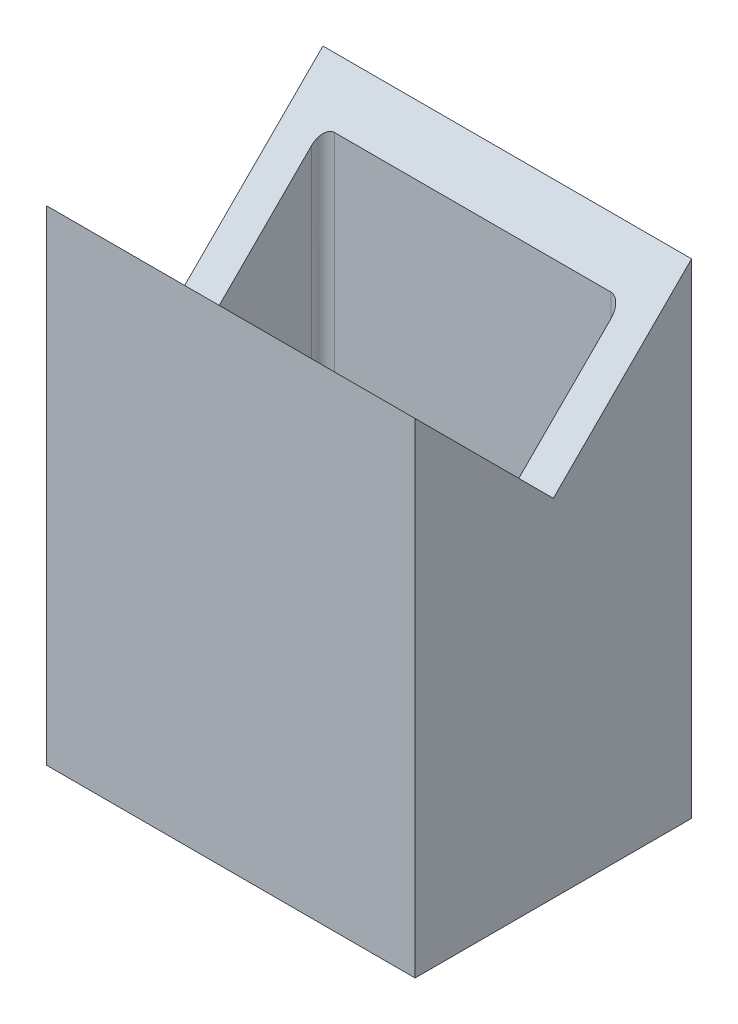
ISO-10303-21;
HEADER;
FILE_DESCRIPTION(('STEP AP214'),'2;1');
FILE_NAME('part.step','',(''),(''),'','','');
FILE_SCHEMA(('AUTOMOTIVE_DESIGN { 1 0 10303 214 1 1 1 1 }'));
ENDSEC;
DATA;
#1=APPLICATION_CONTEXT('core data for automotive mechanical design processes');
#2=APPLICATION_PROTOCOL_DEFINITION('international standard','automotive_design',2000,#1);
#3=PRODUCT_CONTEXT('',#1,'mechanical');
#4=PRODUCT('Part','Part','',(#3));
#5=PRODUCT_RELATED_PRODUCT_CATEGORY('part','',(#4));
#6=PRODUCT_DEFINITION_FORMATION('','',#4);
#7=PRODUCT_DEFINITION_CONTEXT('part definition',#1,'design');
#8=PRODUCT_DEFINITION('design','',#6,#7);
#9=PRODUCT_DEFINITION_SHAPE('','',#8);
#10=(LENGTH_UNIT() NAMED_UNIT(*) SI_UNIT(.MILLI.,.METRE.));
#11=(NAMED_UNIT(*) PLANE_ANGLE_UNIT() SI_UNIT($,.RADIAN.));
#12=(NAMED_UNIT(*) SI_UNIT($,.STERADIAN.) SOLID_ANGLE_UNIT());
#13=UNCERTAINTY_MEASURE_WITH_UNIT(LENGTH_MEASURE(1.E-05),#10,'distance_accuracy_value','');
#14=(GEOMETRIC_REPRESENTATION_CONTEXT(3) GLOBAL_UNCERTAINTY_ASSIGNED_CONTEXT((#13)) GLOBAL_UNIT_ASSIGNED_CONTEXT((#10,
#11,#12)) REPRESENTATION_CONTEXT('',''));
#15=CARTESIAN_POINT('',(0.,0.,0.));
#16=DIRECTION('',(0.,0.,1.));
#17=DIRECTION('',(1.,0.,0.));
#18=AXIS2_PLACEMENT_3D('',#15,#16,#17);
#19=CARTESIAN_POINT('',(41.275,508.,0.));
#20=DIRECTION('',(-1.,0.,0.));
#21=DIRECTION('',(0.,0.,1.));
#22=AXIS2_PLACEMENT_3D('',#19,#20,#21);
#23=PLANE('',#22);
#24=DIRECTION('',(0.,-1.,0.));
#25=VECTOR('',#24,1.);
#26=CARTESIAN_POINT('',(41.275,508.,25.4));
#27=LINE('',#26,#25);
#28=CARTESIAN_POINT('',(41.275,120.8369186,25.4));
#29=VERTEX_POINT('',#28);
#30=CARTESIAN_POINT('',(41.275,0.,25.4));
#31=VERTEX_POINT('',#30);
#32=EDGE_CURVE('E51',#29,#31,#27,.T.);
#33=ORIENTED_EDGE('',*,*,#32,.F.);
#34=DIRECTION('',(0.,-0.707106781186553,-0.707106781186542));
#35=VECTOR('',#34,1.);
#36=CARTESIAN_POINT('',(41.275,301.718459300003,206.2815407));
#37=LINE('',#36,#35);
#38=CARTESIAN_POINT('',(41.275,95.4369186,2.42861286636753E-13));
#39=VERTEX_POINT('',#38);
#40=EDGE_CURVE('E203',#29,#39,#37,.T.);
#41=ORIENTED_EDGE('',*,*,#40,.T.);
#42=DIRECTION('',(0.,0.707106781186543,-0.707106781186552));
#43=VECTOR('',#42,1.);
#44=CARTESIAN_POINT('',(41.275,301.718459299997,-206.2815407));
#45=LINE('',#44,#43);
#46=CARTESIAN_POINT('',(41.275,120.8369186,-25.4));
#47=VERTEX_POINT('',#46);
#48=EDGE_CURVE('E149',#39,#47,#45,.T.);
#49=ORIENTED_EDGE('',*,*,#48,.T.);
#50=DIRECTION('',(0.,-1.,0.));
#51=VECTOR('',#50,1.);
#52=CARTESIAN_POINT('',(41.275,508.,-25.4));
#53=LINE('',#52,#51);
#54=CARTESIAN_POINT('',(41.275,0.,-25.4));
#55=VERTEX_POINT('',#54);
#56=EDGE_CURVE('E255',#47,#55,#53,.T.);
#57=ORIENTED_EDGE('',*,*,#56,.T.);
#58=DIRECTION('',(0.,0.,-1.));
#59=VECTOR('',#58,1.);
#60=CARTESIAN_POINT('',(41.275,0.,0.));
#61=LINE('',#60,#59);
#62=EDGE_CURVE('E222',#31,#55,#61,.T.);
#63=ORIENTED_EDGE('',*,*,#62,.F.);
#64=EDGE_LOOP('',(#33,#41,#49,#57,#63));
#65=FACE_BOUND('',#64,.T.);
#66=ADVANCED_FACE('F42',(#65),#23,.T.);
#67=CARTESIAN_POINT('',(38.1,508.,25.4));
#68=DIRECTION('',(0.,-1.,0.));
#69=DIRECTION('',(0.,0.,-1.));
#70=AXIS2_PLACEMENT_3D('',#67,#68,#69);
#71=CYLINDRICAL_SURFACE('',#70,3.175);
#72=CARTESIAN_POINT('',(38.1,120.8369186,25.4));
#73=DIRECTION('',(0.,0.707106781186542,-0.707106781186553));
#74=DIRECTION('',(0.,-0.707106781186553,-0.707106781186542));
#75=AXIS2_PLACEMENT_3D('',#72,#73,#74);
#76=ELLIPSE('',#75,4.4901280605346,3.175);
#77=CARTESIAN_POINT('',(38.1,124.0119186,28.575));
#78=VERTEX_POINT('',#77);
#79=EDGE_CURVE('E200',#29,#78,#76,.F.);
#80=ORIENTED_EDGE('',*,*,#79,.F.);
#81=ORIENTED_EDGE('',*,*,#32,.T.);
#82=CARTESIAN_POINT('',(38.1,0.,25.4));
#83=DIRECTION('',(0.,1.,0.));
#84=DIRECTION('',(0.,0.,1.));
#85=AXIS2_PLACEMENT_3D('',#82,#83,#84);
#86=CIRCLE('',#85,3.175);
#87=CARTESIAN_POINT('',(38.1,0.,28.575));
#88=VERTEX_POINT('',#87);
#89=EDGE_CURVE('E226',#31,#88,#86,.F.);
#90=ORIENTED_EDGE('',*,*,#89,.T.);
#91=DIRECTION('',(0.,-1.,0.));
#92=VECTOR('',#91,1.);
#93=CARTESIAN_POINT('',(38.1,508.,28.575));
#94=LINE('',#93,#92);
#95=EDGE_CURVE('E273',#78,#88,#94,.T.);
#96=ORIENTED_EDGE('',*,*,#95,.F.);
#97=EDGE_LOOP('',(#80,#81,#90,#96));
#98=FACE_BOUND('',#97,.T.);
#99=ADVANCED_FACE('F319',(#98),#71,.F.);
#100=CARTESIAN_POINT('',(0.,508.,28.575));
#101=DIRECTION('',(0.,0.,-1.));
#102=DIRECTION('',(-1.,0.,0.));
#103=AXIS2_PLACEMENT_3D('',#100,#101,#102);
#104=PLANE('',#103);
#105=DIRECTION('',(0.,-1.,0.));
#106=VECTOR('',#105,1.);
#107=CARTESIAN_POINT('',(-38.1,508.,28.575));
#108=LINE('',#107,#106);
#109=CARTESIAN_POINT('',(-38.1,124.0119186,28.575));
#110=VERTEX_POINT('',#109);
#111=CARTESIAN_POINT('',(-38.1,0.,28.575));
#112=VERTEX_POINT('',#111);
#113=EDGE_CURVE('E270',#110,#112,#108,.T.);
#114=ORIENTED_EDGE('',*,*,#113,.F.);
#115=DIRECTION('',(1.,0.,0.));
#116=VECTOR('',#115,1.);
#117=CARTESIAN_POINT('',(0.,124.0119186,28.575));
#118=LINE('',#117,#116);
#119=EDGE_CURVE('E196',#110,#78,#118,.T.);
#120=ORIENTED_EDGE('',*,*,#119,.T.);
#121=ORIENTED_EDGE('',*,*,#95,.T.);
#122=DIRECTION('',(1.,0.,0.));
#123=VECTOR('',#122,1.);
#124=CARTESIAN_POINT('',(0.,0.,28.575));
#125=LINE('',#124,#123);
#126=EDGE_CURVE('E230',#112,#88,#125,.T.);
#127=ORIENTED_EDGE('',*,*,#126,.F.);
#128=EDGE_LOOP('',(#114,#120,#121,#127));
#129=FACE_BOUND('',#128,.T.);
#130=ADVANCED_FACE('F315',(#129),#104,.T.);
#131=CARTESIAN_POINT('',(-38.1,508.,25.4));
#132=DIRECTION('',(0.,-1.,0.));
#133=DIRECTION('',(0.,0.,-1.));
#134=AXIS2_PLACEMENT_3D('',#131,#132,#133);
#135=CYLINDRICAL_SURFACE('',#134,3.175);
#136=CARTESIAN_POINT('',(-38.1,120.8369186,25.4));
#137=DIRECTION('',(0.,0.707106781186542,-0.707106781186553));
#138=DIRECTION('',(0.,-0.707106781186553,-0.707106781186542));
#139=AXIS2_PLACEMENT_3D('',#136,#137,#138);
#140=ELLIPSE('',#139,4.4901280605346,3.175);
#141=CARTESIAN_POINT('',(-41.275,120.8369186,25.4));
#142=VERTEX_POINT('',#141);
#143=EDGE_CURVE('E193',#110,#142,#140,.F.);
#144=ORIENTED_EDGE('',*,*,#143,.F.);
#145=ORIENTED_EDGE('',*,*,#113,.T.);
#146=CARTESIAN_POINT('',(-38.1,0.,25.4));
#147=DIRECTION('',(0.,1.,0.));
#148=DIRECTION('',(0.,0.,1.));
#149=AXIS2_PLACEMENT_3D('',#146,#147,#148);
#150=CIRCLE('',#149,3.175);
#151=CARTESIAN_POINT('',(-41.275,0.,25.4));
#152=VERTEX_POINT('',#151);
#153=EDGE_CURVE('E234',#112,#152,#150,.F.);
#154=ORIENTED_EDGE('',*,*,#153,.T.);
#155=DIRECTION('',(0.,-1.,0.));
#156=VECTOR('',#155,1.);
#157=CARTESIAN_POINT('',(-41.275,508.,25.4));
#158=LINE('',#157,#156);
#159=EDGE_CURVE('E267',#142,#152,#158,.T.);
#160=ORIENTED_EDGE('',*,*,#159,.F.);
#161=EDGE_LOOP('',(#144,#145,#154,#160));
#162=FACE_BOUND('',#161,.T.);
#163=ADVANCED_FACE('F308',(#162),#135,.F.);
#164=CARTESIAN_POINT('',(-41.275,508.,0.));
#165=DIRECTION('',(-1.,0.,0.));
#166=DIRECTION('',(0.,0.,1.));
#167=AXIS2_PLACEMENT_3D('',#164,#165,#166);
#168=PLANE('',#167);
#169=DIRECTION('',(0.,-0.707106781186553,-0.707106781186542));
#170=VECTOR('',#169,1.);
#171=CARTESIAN_POINT('',(-41.275,301.718459300003,206.2815407));
#172=LINE('',#171,#170);
#173=CARTESIAN_POINT('',(-41.275,95.4369186,2.42861286636753E-13));
#174=VERTEX_POINT('',#173);
#175=EDGE_CURVE('E190',#142,#174,#172,.T.);
#176=ORIENTED_EDGE('',*,*,#175,.F.);
#177=ORIENTED_EDGE('',*,*,#159,.T.);
#178=DIRECTION('',(0.,0.,-1.));
#179=VECTOR('',#178,1.);
#180=CARTESIAN_POINT('',(-41.275,0.,0.));
#181=LINE('',#180,#179);
#182=CARTESIAN_POINT('',(-41.275,0.,-25.4));
#183=VERTEX_POINT('',#182);
#184=EDGE_CURVE('E238',#152,#183,#181,.T.);
#185=ORIENTED_EDGE('',*,*,#184,.T.);
#186=DIRECTION('',(0.,-1.,0.));
#187=VECTOR('',#186,1.);
#188=CARTESIAN_POINT('',(-41.275,508.,-25.4));
#189=LINE('',#188,#187);
#190=CARTESIAN_POINT('',(-41.275,120.8369186,-25.4));
#191=VERTEX_POINT('',#190);
#192=EDGE_CURVE('E264',#191,#183,#189,.T.);
#193=ORIENTED_EDGE('',*,*,#192,.F.);
#194=DIRECTION('',(0.,0.707106781186543,-0.707106781186552));
#195=VECTOR('',#194,1.);
#196=CARTESIAN_POINT('',(-41.275,301.718459299997,-206.2815407));
#197=LINE('',#196,#195);
#198=EDGE_CURVE('E185',#174,#191,#197,.T.);
#199=ORIENTED_EDGE('',*,*,#198,.F.);
#200=EDGE_LOOP('',(#176,#177,#185,#193,#199));
#201=FACE_BOUND('',#200,.T.);
#202=ADVANCED_FACE('F304',(#201),#168,.F.);
#203=CARTESIAN_POINT('',(-38.1,508.,-25.4));
#204=DIRECTION('',(0.,-1.,0.));
#205=DIRECTION('',(0.,0.,-1.));
#206=AXIS2_PLACEMENT_3D('',#203,#204,#205);
#207=CYLINDRICAL_SURFACE('',#206,3.175);
#208=CARTESIAN_POINT('',(-38.1,120.8369186,-25.4));
#209=DIRECTION('',(0.,0.707106781186552,0.707106781186543));
#210=DIRECTION('',(0.,-0.707106781186543,0.707106781186552));
#211=AXIS2_PLACEMENT_3D('',#208,#209,#210);
#212=ELLIPSE('',#211,4.49012806053454,3.175);
#213=CARTESIAN_POINT('',(-38.1,124.0119186,-28.575));
#214=VERTEX_POINT('',#213);
#215=EDGE_CURVE('E170',#191,#214,#212,.F.);
#216=ORIENTED_EDGE('',*,*,#215,.F.);
#217=ORIENTED_EDGE('',*,*,#192,.T.);
#218=CARTESIAN_POINT('',(-38.1,0.,-25.4));
#219=DIRECTION('',(0.,1.,0.));
#220=DIRECTION('',(0.,0.,1.));
#221=AXIS2_PLACEMENT_3D('',#218,#219,#220);
#222=CIRCLE('',#221,3.175);
#223=CARTESIAN_POINT('',(-38.1,0.,-28.575));
#224=VERTEX_POINT('',#223);
#225=EDGE_CURVE('E242',#183,#224,#222,.F.);
#226=ORIENTED_EDGE('',*,*,#225,.T.);
#227=DIRECTION('',(0.,-1.,0.));
#228=VECTOR('',#227,1.);
#229=CARTESIAN_POINT('',(-38.1,508.,-28.575));
#230=LINE('',#229,#228);
#231=EDGE_CURVE('E261',#214,#224,#230,.T.);
#232=ORIENTED_EDGE('',*,*,#231,.F.);
#233=EDGE_LOOP('',(#216,#217,#226,#232));
#234=FACE_BOUND('',#233,.T.);
#235=ADVANCED_FACE('F334',(#234),#207,.F.);
#236=CARTESIAN_POINT('',(0.,508.,-28.575));
#237=DIRECTION('',(0.,0.,-1.));
#238=DIRECTION('',(-1.,0.,0.));
#239=AXIS2_PLACEMENT_3D('',#236,#237,#238);
#240=PLANE('',#239);
#241=DIRECTION('',(1.,0.,0.));
#242=VECTOR('',#241,1.);
#243=CARTESIAN_POINT('',(0.,124.0119186,-28.575));
#244=LINE('',#243,#242);
#245=CARTESIAN_POINT('',(38.1,124.0119186,-28.575));
#246=VERTEX_POINT('',#245);
#247=EDGE_CURVE('E65',#214,#246,#244,.T.);
#248=ORIENTED_EDGE('',*,*,#247,.F.);
#249=ORIENTED_EDGE('',*,*,#231,.T.);
#250=DIRECTION('',(1.,0.,0.));
#251=VECTOR('',#250,1.);
#252=CARTESIAN_POINT('',(0.,0.,-28.575));
#253=LINE('',#252,#251);
#254=CARTESIAN_POINT('',(38.1,0.,-28.575));
#255=VERTEX_POINT('',#254);
#256=EDGE_CURVE('E246',#224,#255,#253,.T.);
#257=ORIENTED_EDGE('',*,*,#256,.T.);
#258=DIRECTION('',(0.,-1.,0.));
#259=VECTOR('',#258,1.);
#260=CARTESIAN_POINT('',(38.1,508.,-28.575));
#261=LINE('',#260,#259);
#262=EDGE_CURVE('E258',#246,#255,#261,.T.);
#263=ORIENTED_EDGE('',*,*,#262,.F.);
#264=EDGE_LOOP('',(#248,#249,#257,#263));
#265=FACE_BOUND('',#264,.T.);
#266=ADVANCED_FACE('F330',(#265),#240,.F.);
#267=CARTESIAN_POINT('',(50.8,508.,0.));
#268=DIRECTION('',(1.,0.,0.));
#269=DIRECTION('',(0.,0.,-1.));
#270=AXIS2_PLACEMENT_3D('',#267,#268,#269);
#271=PLANE('',#270);
#272=DIRECTION('',(0.,-0.707106781186543,0.707106781186552));
#273=VECTOR('',#272,1.);
#274=CARTESIAN_POINT('',(50.8,47.7184593000008,47.7184593000001));
#275=LINE('',#274,#273);
#276=CARTESIAN_POINT('',(50.8,133.5369186,-38.1));
#277=VERTEX_POINT('',#276);
#278=CARTESIAN_POINT('',(50.8,95.4369186,2.42861286636753E-13));
#279=VERTEX_POINT('',#278);
#280=EDGE_CURVE('E146',#277,#279,#275,.T.);
#281=ORIENTED_EDGE('',*,*,#280,.T.);
#282=DIRECTION('',(0.,0.707106781186553,0.707106781186542));
#283=VECTOR('',#282,1.);
#284=CARTESIAN_POINT('',(50.8,47.7184592999992,-47.7184592999999));
#285=LINE('',#284,#283);
#286=CARTESIAN_POINT('',(50.8,133.5369186,38.1));
#287=VERTEX_POINT('',#286);
#288=EDGE_CURVE('E156',#279,#287,#285,.T.);
#289=ORIENTED_EDGE('',*,*,#288,.T.);
#290=DIRECTION('',(0.,-1.,0.));
#291=VECTOR('',#290,1.);
#292=CARTESIAN_POINT('',(50.8,508.,38.1));
#293=LINE('',#292,#291);
#294=CARTESIAN_POINT('',(50.8,0.,38.1));
#295=VERTEX_POINT('',#294);
#296=EDGE_CURVE('E254',#287,#295,#293,.T.);
#297=ORIENTED_EDGE('',*,*,#296,.T.);
#298=DIRECTION('',(0.,0.,1.));
#299=VECTOR('',#298,1.);
#300=CARTESIAN_POINT('',(50.8,0.,0.));
#301=LINE('',#300,#299);
#302=CARTESIAN_POINT('',(50.8,0.,-38.1));
#303=VERTEX_POINT('',#302);
#304=EDGE_CURVE('E206',#303,#295,#301,.T.);
#305=ORIENTED_EDGE('',*,*,#304,.F.);
#306=DIRECTION('',(0.,-1.,0.));
#307=VECTOR('',#306,1.);
#308=CARTESIAN_POINT('',(50.8,508.,-38.1));
#309=LINE('',#308,#307);
#310=EDGE_CURVE('E165',#277,#303,#309,.T.);
#311=ORIENTED_EDGE('',*,*,#310,.F.);
#312=EDGE_LOOP('',(#281,#289,#297,#305,#311));
#313=FACE_BOUND('',#312,.T.);
#314=ADVANCED_FACE('F44',(#313),#271,.T.);
#315=CARTESIAN_POINT('',(0.,508.,-38.1));
#316=DIRECTION('',(0.,0.,-1.));
#317=DIRECTION('',(-1.,0.,0.));
#318=AXIS2_PLACEMENT_3D('',#315,#316,#317);
#319=PLANE('',#318);
#320=DIRECTION('',(0.,-1.,0.));
#321=VECTOR('',#320,1.);
#322=CARTESIAN_POINT('',(-50.8,508.,-38.1));
#323=LINE('',#322,#321);
#324=CARTESIAN_POINT('',(-50.8,133.5369186,-38.1));
#325=VERTEX_POINT('',#324);
#326=CARTESIAN_POINT('',(-50.8,0.,-38.1));
#327=VERTEX_POINT('',#326);
#328=EDGE_CURVE('E283',#325,#327,#323,.T.);
#329=ORIENTED_EDGE('',*,*,#328,.F.);
#330=DIRECTION('',(1.,0.,0.));
#331=VECTOR('',#330,1.);
#332=CARTESIAN_POINT('',(-470.341101841361,133.5369186,-38.1));
#333=LINE('',#332,#331);
#334=EDGE_CURVE('E161',#325,#277,#333,.T.);
#335=ORIENTED_EDGE('',*,*,#334,.T.);
#336=ORIENTED_EDGE('',*,*,#310,.T.);
#337=DIRECTION('',(1.,0.,0.));
#338=VECTOR('',#337,1.);
#339=CARTESIAN_POINT('',(0.,0.,-38.1));
#340=LINE('',#339,#338);
#341=EDGE_CURVE('E210',#327,#303,#340,.T.);
#342=ORIENTED_EDGE('',*,*,#341,.F.);
#343=EDGE_LOOP('',(#329,#335,#336,#342));
#344=FACE_BOUND('',#343,.T.);
#345=ADVANCED_FACE('F289',(#344),#319,.T.);
#346=CARTESIAN_POINT('',(-50.8,508.,0.));
#347=DIRECTION('',(-1.,0.,0.));
#348=DIRECTION('',(0.,0.,1.));
#349=AXIS2_PLACEMENT_3D('',#346,#347,#348);
#350=PLANE('',#349);
#351=DIRECTION('',(0.,-1.,0.));
#352=VECTOR('',#351,1.);
#353=CARTESIAN_POINT('',(-50.8,508.,38.1));
#354=LINE('',#353,#352);
#355=CARTESIAN_POINT('',(-50.8,133.5369186,38.1));
#356=VERTEX_POINT('',#355);
#357=CARTESIAN_POINT('',(-50.8,0.,38.1));
#358=VERTEX_POINT('',#357);
#359=EDGE_CURVE('E280',#356,#358,#354,.T.);
#360=ORIENTED_EDGE('',*,*,#359,.F.);
#361=DIRECTION('',(0.,0.707106781186553,0.707106781186542));
#362=VECTOR('',#361,1.);
#363=CARTESIAN_POINT('',(-50.8,47.7184592999992,-47.7184592999999));
#364=LINE('',#363,#362);
#365=CARTESIAN_POINT('',(-50.8,95.4369186,2.42861286636753E-13));
#366=VERTEX_POINT('',#365);
#367=EDGE_CURVE('E58',#366,#356,#364,.T.);
#368=ORIENTED_EDGE('',*,*,#367,.F.);
#369=DIRECTION('',(0.,-0.707106781186543,0.707106781186552));
#370=VECTOR('',#369,1.);
#371=CARTESIAN_POINT('',(-50.8,47.7184593000008,47.7184593000001));
#372=LINE('',#371,#370);
#373=EDGE_CURVE('E174',#325,#366,#372,.T.);
#374=ORIENTED_EDGE('',*,*,#373,.F.);
#375=ORIENTED_EDGE('',*,*,#328,.T.);
#376=DIRECTION('',(0.,0.,-1.));
#377=VECTOR('',#376,1.);
#378=CARTESIAN_POINT('',(-50.8,0.,0.));
#379=LINE('',#378,#377);
#380=EDGE_CURVE('E214',#358,#327,#379,.T.);
#381=ORIENTED_EDGE('',*,*,#380,.F.);
#382=EDGE_LOOP('',(#360,#368,#374,#375,#381));
#383=FACE_BOUND('',#382,.T.);
#384=ADVANCED_FACE('F297',(#383),#350,.T.);
#385=CARTESIAN_POINT('',(0.,508.,38.1));
#386=DIRECTION('',(0.,0.,-1.));
#387=DIRECTION('',(-1.,0.,0.));
#388=AXIS2_PLACEMENT_3D('',#385,#386,#387);
#389=PLANE('',#388);
#390=DIRECTION('',(1.,0.,0.));
#391=VECTOR('',#390,1.);
#392=CARTESIAN_POINT('',(-470.341101841361,133.5369186,38.1));
#393=LINE('',#392,#391);
#394=EDGE_CURVE('E153',#356,#287,#393,.T.);
#395=ORIENTED_EDGE('',*,*,#394,.F.);
#396=ORIENTED_EDGE('',*,*,#359,.T.);
#397=DIRECTION('',(1.,0.,0.));
#398=VECTOR('',#397,1.);
#399=CARTESIAN_POINT('',(0.,0.,38.1));
#400=LINE('',#399,#398);
#401=EDGE_CURVE('E218',#358,#295,#400,.T.);
#402=ORIENTED_EDGE('',*,*,#401,.T.);
#403=ORIENTED_EDGE('',*,*,#296,.F.);
#404=EDGE_LOOP('',(#395,#396,#402,#403));
#405=FACE_BOUND('',#404,.T.);
#406=ADVANCED_FACE('F351',(#405),#389,.F.);
#407=CARTESIAN_POINT('',(38.1,508.,-25.4));
#408=DIRECTION('',(0.,-1.,0.));
#409=DIRECTION('',(0.,0.,-1.));
#410=AXIS2_PLACEMENT_3D('',#407,#408,#409);
#411=CYLINDRICAL_SURFACE('',#410,3.175);
#412=CARTESIAN_POINT('',(38.1,120.8369186,-25.4));
#413=DIRECTION('',(0.,0.707106781186552,0.707106781186543));
#414=DIRECTION('',(0.,-0.707106781186543,0.707106781186552));
#415=AXIS2_PLACEMENT_3D('',#412,#413,#414);
#416=ELLIPSE('',#415,4.49012806053454,3.175);
#417=EDGE_CURVE('E11',#246,#47,#416,.F.);
#418=ORIENTED_EDGE('',*,*,#417,.F.);
#419=ORIENTED_EDGE('',*,*,#262,.T.);
#420=CARTESIAN_POINT('',(38.1,0.,-25.4));
#421=DIRECTION('',(0.,1.,0.));
#422=DIRECTION('',(0.,0.,1.));
#423=AXIS2_PLACEMENT_3D('',#420,#421,#422);
#424=CIRCLE('',#423,3.175);
#425=EDGE_CURVE('E250',#255,#55,#424,.F.);
#426=ORIENTED_EDGE('',*,*,#425,.T.);
#427=ORIENTED_EDGE('',*,*,#56,.F.);
#428=EDGE_LOOP('',(#418,#419,#426,#427));
#429=FACE_BOUND('',#428,.T.);
#430=ADVANCED_FACE('F326',(#429),#411,.F.);
#431=CARTESIAN_POINT('',(0.,0.,0.));
#432=DIRECTION('',(0.,1.,0.));
#433=DIRECTION('',(0.,0.,1.));
#434=AXIS2_PLACEMENT_3D('',#431,#432,#433);
#435=PLANE('',#434);
#436=ORIENTED_EDGE('',*,*,#304,.T.);
#437=ORIENTED_EDGE('',*,*,#401,.F.);
#438=ORIENTED_EDGE('',*,*,#380,.T.);
#439=ORIENTED_EDGE('',*,*,#341,.T.);
#440=EDGE_LOOP('',(#436,#437,#438,#439));
#441=FACE_BOUND('',#440,.T.);
#442=ORIENTED_EDGE('',*,*,#62,.T.);
#443=ORIENTED_EDGE('',*,*,#425,.F.);
#444=ORIENTED_EDGE('',*,*,#256,.F.);
#445=ORIENTED_EDGE('',*,*,#225,.F.);
#446=ORIENTED_EDGE('',*,*,#184,.F.);
#447=ORIENTED_EDGE('',*,*,#153,.F.);
#448=ORIENTED_EDGE('',*,*,#126,.T.);
#449=ORIENTED_EDGE('',*,*,#89,.F.);
#450=EDGE_LOOP('',(#442,#443,#444,#445,#446,#447,#448,#449));
#451=FACE_BOUND('',#450,.T.);
#452=ADVANCED_FACE('F292',(#441,#451),#435,.F.);
#453=CARTESIAN_POINT('',(-470.341101841361,47.7184592999992,-47.7184592999999));
#454=DIRECTION('',(0.,0.707106781186542,-0.707106781186553));
#455=DIRECTION('',(0.,0.707106781186553,0.707106781186542));
#456=AXIS2_PLACEMENT_3D('',#453,#454,#455);
#457=PLANE('',#456);
#458=ORIENTED_EDGE('',*,*,#79,.T.);
#459=ORIENTED_EDGE('',*,*,#119,.F.);
#460=ORIENTED_EDGE('',*,*,#143,.T.);
#461=ORIENTED_EDGE('',*,*,#175,.T.);
#462=DIRECTION('',(1.,0.,0.));
#463=VECTOR('',#462,1.);
#464=CARTESIAN_POINT('',(-470.341101841361,95.4369186,2.42861286636753E-13));
#465=LINE('',#464,#463);
#466=EDGE_CURVE('E152',#366,#174,#465,.T.);
#467=ORIENTED_EDGE('',*,*,#466,.F.);
#468=ORIENTED_EDGE('',*,*,#367,.T.);
#469=ORIENTED_EDGE('',*,*,#394,.T.);
#470=ORIENTED_EDGE('',*,*,#288,.F.);
#471=EDGE_CURVE('E142',#39,#279,#465,.T.);
#472=ORIENTED_EDGE('',*,*,#471,.F.);
#473=ORIENTED_EDGE('',*,*,#40,.F.);
#474=EDGE_LOOP('',(#458,#459,#460,#461,#467,#468,#469,#470,#472,#473));
#475=FACE_BOUND('',#474,.T.);
#476=ADVANCED_FACE('F157',(#475),#457,.T.);
#477=CARTESIAN_POINT('',(-470.341101841361,47.7184593000008,47.7184593000001));
#478=DIRECTION('',(0.,0.707106781186552,0.707106781186543));
#479=DIRECTION('',(0.,-0.707106781186543,0.707106781186552));
#480=AXIS2_PLACEMENT_3D('',#477,#478,#479);
#481=PLANE('',#480);
#482=ORIENTED_EDGE('',*,*,#471,.T.);
#483=ORIENTED_EDGE('',*,*,#280,.F.);
#484=ORIENTED_EDGE('',*,*,#334,.F.);
#485=ORIENTED_EDGE('',*,*,#373,.T.);
#486=ORIENTED_EDGE('',*,*,#466,.T.);
#487=ORIENTED_EDGE('',*,*,#198,.T.);
#488=ORIENTED_EDGE('',*,*,#215,.T.);
#489=ORIENTED_EDGE('',*,*,#247,.T.);
#490=ORIENTED_EDGE('',*,*,#417,.T.);
#491=ORIENTED_EDGE('',*,*,#48,.F.);
#492=EDGE_LOOP('',(#482,#483,#484,#485,#486,#487,#488,#489,#490,#491));
#493=FACE_BOUND('',#492,.T.);
#494=ADVANCED_FACE('F144',(#493),#481,.T.);
#495=CLOSED_SHELL('',(#66,#99,#130,#163,#202,#235,#266,#314,#345,#384,#406,#430,#452,#476,#494));
#496=MANIFOLD_SOLID_BREP('B2',#495);
#497=ADVANCED_BREP_SHAPE_REPRESENTATION('',(#18,#496),#14);
#498=SHAPE_DEFINITION_REPRESENTATION(#9,#497);
ENDSEC;
END-ISO-10303-21;
